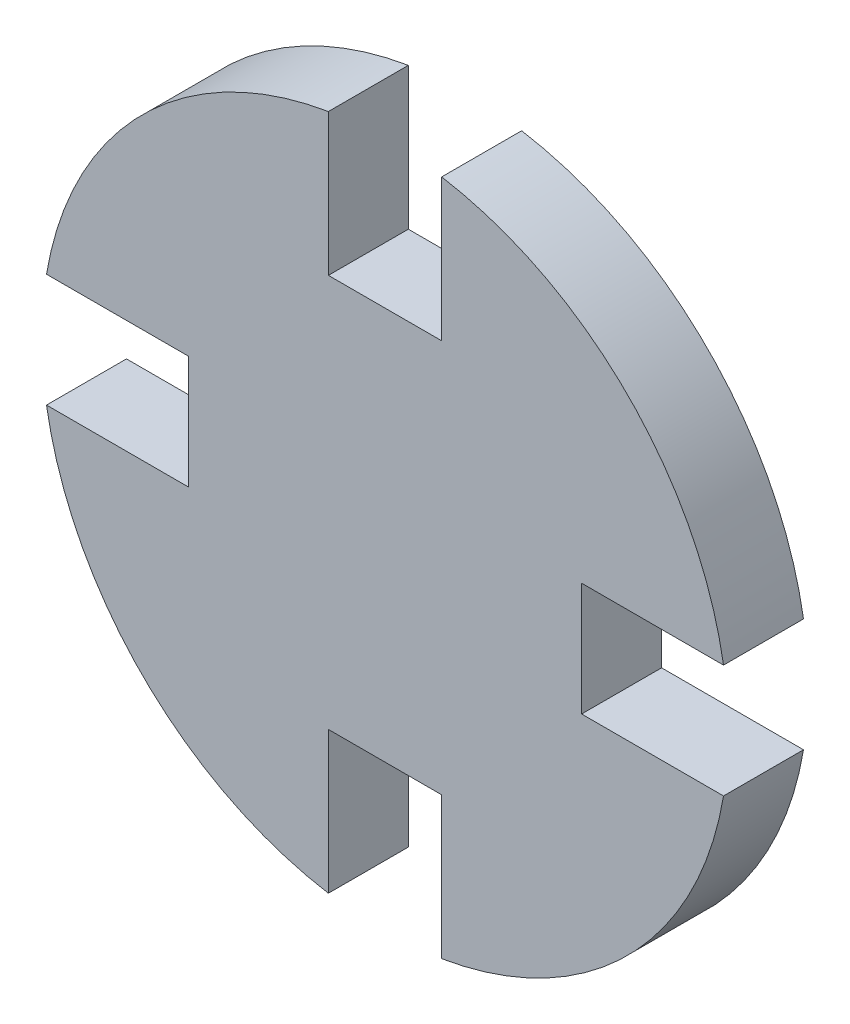
ISO-10303-21;
HEADER;
FILE_DESCRIPTION(('STEP AP214'),'2;1');
FILE_NAME('part.step','',(''),(''),'','','');
FILE_SCHEMA(('AUTOMOTIVE_DESIGN { 1 0 10303 214 1 1 1 1 }'));
ENDSEC;
DATA;
#1=APPLICATION_CONTEXT('core data for automotive mechanical design processes');
#2=APPLICATION_PROTOCOL_DEFINITION('international standard','automotive_design',2000,#1);
#3=PRODUCT_CONTEXT('',#1,'mechanical');
#4=PRODUCT('Part','Part','',(#3));
#5=PRODUCT_RELATED_PRODUCT_CATEGORY('part','',(#4));
#6=PRODUCT_DEFINITION_FORMATION('','',#4);
#7=PRODUCT_DEFINITION_CONTEXT('part definition',#1,'design');
#8=PRODUCT_DEFINITION('design','',#6,#7);
#9=PRODUCT_DEFINITION_SHAPE('','',#8);
#10=(LENGTH_UNIT() NAMED_UNIT(*) SI_UNIT(.MILLI.,.METRE.));
#11=(NAMED_UNIT(*) PLANE_ANGLE_UNIT() SI_UNIT($,.RADIAN.));
#12=(NAMED_UNIT(*) SI_UNIT($,.STERADIAN.) SOLID_ANGLE_UNIT());
#13=UNCERTAINTY_MEASURE_WITH_UNIT(LENGTH_MEASURE(1.E-05),#10,'distance_accuracy_value','');
#14=(GEOMETRIC_REPRESENTATION_CONTEXT(3) GLOBAL_UNCERTAINTY_ASSIGNED_CONTEXT((#13)) GLOBAL_UNIT_ASSIGNED_CONTEXT((#10,
#11,#12)) REPRESENTATION_CONTEXT('',''));
#15=CARTESIAN_POINT('',(0.,0.,0.));
#16=DIRECTION('',(0.,0.,1.));
#17=DIRECTION('',(1.,0.,0.));
#18=AXIS2_PLACEMENT_3D('',#15,#16,#17);
#19=CARTESIAN_POINT('',(0.,0.,3.));
#20=DIRECTION('',(0.,0.,-1.));
#21=DIRECTION('',(-1.,0.,0.));
#22=AXIS2_PLACEMENT_3D('',#19,#20,#21);
#23=CYLINDRICAL_SURFACE('',#22,25.75);
#24=CARTESIAN_POINT('',(0.,0.,-3.));
#25=DIRECTION('',(0.,0.,1.));
#26=DIRECTION('',(1.,0.,0.));
#27=AXIS2_PLACEMENT_3D('',#24,#25,#26);
#28=CIRCLE('',#27,25.75);
#29=CARTESIAN_POINT('',(-4.25,25.3968501984006,-3.));
#30=VERTEX_POINT('',#29);
#31=CARTESIAN_POINT('',(-25.3968501984005,4.25000000000027,-3.));
#32=VERTEX_POINT('',#31);
#33=EDGE_CURVE('E181',#30,#32,#28,.T.);
#34=ORIENTED_EDGE('',*,*,#33,.T.);
#35=DIRECTION('',(0.,0.,-1.));
#36=VECTOR('',#35,1.);
#37=CARTESIAN_POINT('',(-25.3968501984005,4.25000000000027,3.));
#38=LINE('',#37,#36);
#39=CARTESIAN_POINT('',(-25.3968501984005,4.25000000000027,3.));
#40=VERTEX_POINT('',#39);
#41=EDGE_CURVE('E11',#40,#32,#38,.T.);
#42=ORIENTED_EDGE('',*,*,#41,.F.);
#43=CARTESIAN_POINT('',(0.,0.,3.));
#44=DIRECTION('',(0.,0.,1.));
#45=DIRECTION('',(1.,0.,0.));
#46=AXIS2_PLACEMENT_3D('',#43,#44,#45);
#47=CIRCLE('',#46,25.75);
#48=CARTESIAN_POINT('',(-4.25,25.3968501984006,3.));
#49=VERTEX_POINT('',#48);
#50=EDGE_CURVE('E212',#49,#40,#47,.T.);
#51=ORIENTED_EDGE('',*,*,#50,.F.);
#52=DIRECTION('',(0.,0.,-1.));
#53=VECTOR('',#52,1.);
#54=CARTESIAN_POINT('',(-4.25,25.3968501984006,3.));
#55=LINE('',#54,#53);
#56=EDGE_CURVE('E177',#49,#30,#55,.T.);
#57=ORIENTED_EDGE('',*,*,#56,.T.);
#58=EDGE_LOOP('',(#34,#42,#51,#57));
#59=FACE_BOUND('',#58,.T.);
#60=ADVANCED_FACE('F37',(#59),#23,.T.);
#61=CARTESIAN_POINT('',(-25.3968501984005,4.25000000000027,3.));
#62=DIRECTION('',(0.,1.,0.));
#63=DIRECTION('',(-1.,0.,0.));
#64=AXIS2_PLACEMENT_3D('',#61,#62,#63);
#65=PLANE('',#64);
#66=DIRECTION('',(1.,0.,0.));
#67=VECTOR('',#66,1.);
#68=CARTESIAN_POINT('',(-25.3968501984005,4.25000000000027,-3.));
#69=LINE('',#68,#67);
#70=CARTESIAN_POINT('',(-14.75,4.25000000000027,-3.));
#71=VERTEX_POINT('',#70);
#72=EDGE_CURVE('E184',#32,#71,#69,.T.);
#73=ORIENTED_EDGE('',*,*,#72,.T.);
#74=DIRECTION('',(0.,0.,-1.));
#75=VECTOR('',#74,1.);
#76=CARTESIAN_POINT('',(-14.75,4.25000000000027,3.));
#77=LINE('',#76,#75);
#78=CARTESIAN_POINT('',(-14.75,4.25000000000027,3.));
#79=VERTEX_POINT('',#78);
#80=EDGE_CURVE('E45',#79,#71,#77,.T.);
#81=ORIENTED_EDGE('',*,*,#80,.F.);
#82=DIRECTION('',(1.,0.,0.));
#83=VECTOR('',#82,1.);
#84=CARTESIAN_POINT('',(-25.3968501984005,4.25000000000027,3.));
#85=LINE('',#84,#83);
#86=EDGE_CURVE('E120',#40,#79,#85,.T.);
#87=ORIENTED_EDGE('',*,*,#86,.F.);
#88=ORIENTED_EDGE('',*,*,#41,.T.);
#89=EDGE_LOOP('',(#73,#81,#87,#88));
#90=FACE_BOUND('',#89,.T.);
#91=ADVANCED_FACE('F310',(#90),#65,.F.);
#92=CARTESIAN_POINT('',(-14.75,4.25000000000027,3.));
#93=DIRECTION('',(1.,0.,0.));
#94=DIRECTION('',(0.,0.,-1.));
#95=AXIS2_PLACEMENT_3D('',#92,#93,#94);
#96=PLANE('',#95);
#97=DIRECTION('',(0.,-1.,0.));
#98=VECTOR('',#97,1.);
#99=CARTESIAN_POINT('',(-14.75,4.25000000000027,-3.));
#100=LINE('',#99,#98);
#101=CARTESIAN_POINT('',(-14.75,-4.24999999999984,-3.));
#102=VERTEX_POINT('',#101);
#103=EDGE_CURVE('E187',#71,#102,#100,.T.);
#104=ORIENTED_EDGE('',*,*,#103,.T.);
#105=DIRECTION('',(0.,0.,-1.));
#106=VECTOR('',#105,1.);
#107=CARTESIAN_POINT('',(-14.75,-4.24999999999984,3.));
#108=LINE('',#107,#106);
#109=CARTESIAN_POINT('',(-14.75,-4.24999999999984,3.));
#110=VERTEX_POINT('',#109);
#111=EDGE_CURVE('E243',#110,#102,#108,.T.);
#112=ORIENTED_EDGE('',*,*,#111,.F.);
#113=DIRECTION('',(0.,-1.,0.));
#114=VECTOR('',#113,1.);
#115=CARTESIAN_POINT('',(-14.75,4.25000000000027,3.));
#116=LINE('',#115,#114);
#117=EDGE_CURVE('E251',#79,#110,#116,.T.);
#118=ORIENTED_EDGE('',*,*,#117,.F.);
#119=ORIENTED_EDGE('',*,*,#80,.T.);
#120=EDGE_LOOP('',(#104,#112,#118,#119));
#121=FACE_BOUND('',#120,.T.);
#122=ADVANCED_FACE('F249',(#121),#96,.F.);
#123=CARTESIAN_POINT('',(-14.75,-4.24999999999984,3.));
#124=DIRECTION('',(0.,-1.,0.));
#125=DIRECTION('',(1.,0.,0.));
#126=AXIS2_PLACEMENT_3D('',#123,#124,#125);
#127=PLANE('',#126);
#128=DIRECTION('',(-1.,0.,0.));
#129=VECTOR('',#128,1.);
#130=CARTESIAN_POINT('',(-14.75,-4.24999999999984,-3.));
#131=LINE('',#130,#129);
#132=CARTESIAN_POINT('',(-25.3968501984006,-4.24999999999982,-3.));
#133=VERTEX_POINT('',#132);
#134=EDGE_CURVE('E189',#102,#133,#131,.T.);
#135=ORIENTED_EDGE('',*,*,#134,.T.);
#136=DIRECTION('',(0.,0.,-1.));
#137=VECTOR('',#136,1.);
#138=CARTESIAN_POINT('',(-25.3968501984006,-4.24999999999982,3.));
#139=LINE('',#138,#137);
#140=CARTESIAN_POINT('',(-25.3968501984006,-4.24999999999982,3.));
#141=VERTEX_POINT('',#140);
#142=EDGE_CURVE('E240',#141,#133,#139,.T.);
#143=ORIENTED_EDGE('',*,*,#142,.F.);
#144=DIRECTION('',(-1.,0.,0.));
#145=VECTOR('',#144,1.);
#146=CARTESIAN_POINT('',(-14.75,-4.24999999999984,3.));
#147=LINE('',#146,#145);
#148=EDGE_CURVE('E269',#110,#141,#147,.T.);
#149=ORIENTED_EDGE('',*,*,#148,.F.);
#150=ORIENTED_EDGE('',*,*,#111,.T.);
#151=EDGE_LOOP('',(#135,#143,#149,#150));
#152=FACE_BOUND('',#151,.T.);
#153=ADVANCED_FACE('F260',(#152),#127,.F.);
#154=CARTESIAN_POINT('',(0.,0.,3.));
#155=DIRECTION('',(0.,0.,-1.));
#156=DIRECTION('',(-1.,0.,0.));
#157=AXIS2_PLACEMENT_3D('',#154,#155,#156);
#158=CYLINDRICAL_SURFACE('',#157,25.75);
#159=CARTESIAN_POINT('',(0.,0.,-3.));
#160=DIRECTION('',(0.,0.,1.));
#161=DIRECTION('',(1.,0.,0.));
#162=AXIS2_PLACEMENT_3D('',#159,#160,#161);
#163=CIRCLE('',#162,25.75);
#164=CARTESIAN_POINT('',(-4.25,-25.3968501984006,-3.));
#165=VERTEX_POINT('',#164);
#166=EDGE_CURVE('E191',#133,#165,#163,.T.);
#167=ORIENTED_EDGE('',*,*,#166,.T.);
#168=DIRECTION('',(0.,0.,-1.));
#169=VECTOR('',#168,1.);
#170=CARTESIAN_POINT('',(-4.25,-25.3968501984006,3.));
#171=LINE('',#170,#169);
#172=CARTESIAN_POINT('',(-4.25,-25.3968501984006,3.));
#173=VERTEX_POINT('',#172);
#174=EDGE_CURVE('E237',#173,#165,#171,.T.);
#175=ORIENTED_EDGE('',*,*,#174,.F.);
#176=CARTESIAN_POINT('',(0.,0.,3.));
#177=DIRECTION('',(0.,0.,1.));
#178=DIRECTION('',(1.,0.,0.));
#179=AXIS2_PLACEMENT_3D('',#176,#177,#178);
#180=CIRCLE('',#179,25.75);
#181=EDGE_CURVE('E266',#141,#173,#180,.T.);
#182=ORIENTED_EDGE('',*,*,#181,.F.);
#183=ORIENTED_EDGE('',*,*,#142,.T.);
#184=EDGE_LOOP('',(#167,#175,#182,#183));
#185=FACE_BOUND('',#184,.T.);
#186=ADVANCED_FACE('F264',(#185),#158,.T.);
#187=CARTESIAN_POINT('',(-4.25,-25.3968501984006,3.));
#188=DIRECTION('',(-1.,0.,0.));
#189=DIRECTION('',(0.,-1.,0.));
#190=AXIS2_PLACEMENT_3D('',#187,#188,#189);
#191=PLANE('',#190);
#192=DIRECTION('',(0.,1.,0.));
#193=VECTOR('',#192,1.);
#194=CARTESIAN_POINT('',(-4.25,-25.3968501984006,-3.));
#195=LINE('',#194,#193);
#196=CARTESIAN_POINT('',(-4.25,-14.75,-3.));
#197=VERTEX_POINT('',#196);
#198=EDGE_CURVE('E193',#165,#197,#195,.T.);
#199=ORIENTED_EDGE('',*,*,#198,.T.);
#200=DIRECTION('',(0.,0.,-1.));
#201=VECTOR('',#200,1.);
#202=CARTESIAN_POINT('',(-4.25,-14.75,3.));
#203=LINE('',#202,#201);
#204=CARTESIAN_POINT('',(-4.25,-14.75,3.));
#205=VERTEX_POINT('',#204);
#206=EDGE_CURVE('E234',#205,#197,#203,.T.);
#207=ORIENTED_EDGE('',*,*,#206,.F.);
#208=DIRECTION('',(0.,1.,0.));
#209=VECTOR('',#208,1.);
#210=CARTESIAN_POINT('',(-4.25,-25.3968501984006,3.));
#211=LINE('',#210,#209);
#212=EDGE_CURVE('E268',#173,#205,#211,.T.);
#213=ORIENTED_EDGE('',*,*,#212,.F.);
#214=ORIENTED_EDGE('',*,*,#174,.T.);
#215=EDGE_LOOP('',(#199,#207,#213,#214));
#216=FACE_BOUND('',#215,.T.);
#217=ADVANCED_FACE('F323',(#216),#191,.F.);
#218=CARTESIAN_POINT('',(-4.25,-14.75,3.));
#219=DIRECTION('',(0.,1.,0.));
#220=DIRECTION('',(0.,0.,1.));
#221=AXIS2_PLACEMENT_3D('',#218,#219,#220);
#222=PLANE('',#221);
#223=DIRECTION('',(1.,0.,0.));
#224=VECTOR('',#223,1.);
#225=CARTESIAN_POINT('',(-4.25,-14.75,-3.));
#226=LINE('',#225,#224);
#227=CARTESIAN_POINT('',(4.25,-14.75,-3.));
#228=VERTEX_POINT('',#227);
#229=EDGE_CURVE('E195',#197,#228,#226,.T.);
#230=ORIENTED_EDGE('',*,*,#229,.T.);
#231=DIRECTION('',(0.,0.,-1.));
#232=VECTOR('',#231,1.);
#233=CARTESIAN_POINT('',(4.25,-14.75,3.));
#234=LINE('',#233,#232);
#235=CARTESIAN_POINT('',(4.25,-14.75,3.));
#236=VERTEX_POINT('',#235);
#237=EDGE_CURVE('E231',#236,#228,#234,.T.);
#238=ORIENTED_EDGE('',*,*,#237,.F.);
#239=DIRECTION('',(1.,0.,0.));
#240=VECTOR('',#239,1.);
#241=CARTESIAN_POINT('',(-4.25,-14.75,3.));
#242=LINE('',#241,#240);
#243=EDGE_CURVE('E271',#205,#236,#242,.T.);
#244=ORIENTED_EDGE('',*,*,#243,.F.);
#245=ORIENTED_EDGE('',*,*,#206,.T.);
#246=EDGE_LOOP('',(#230,#238,#244,#245));
#247=FACE_BOUND('',#246,.T.);
#248=ADVANCED_FACE('F326',(#247),#222,.F.);
#249=CARTESIAN_POINT('',(4.25,-14.75,3.));
#250=DIRECTION('',(1.,0.,0.));
#251=DIRECTION('',(0.,1.,0.));
#252=AXIS2_PLACEMENT_3D('',#249,#250,#251);
#253=PLANE('',#252);
#254=DIRECTION('',(0.,-1.,0.));
#255=VECTOR('',#254,1.);
#256=CARTESIAN_POINT('',(4.25,-14.75,-3.));
#257=LINE('',#256,#255);
#258=CARTESIAN_POINT('',(4.24999999999999,-25.3968501984006,-3.));
#259=VERTEX_POINT('',#258);
#260=EDGE_CURVE('E197',#228,#259,#257,.T.);
#261=ORIENTED_EDGE('',*,*,#260,.T.);
#262=DIRECTION('',(0.,0.,-1.));
#263=VECTOR('',#262,1.);
#264=CARTESIAN_POINT('',(4.24999999999999,-25.3968501984006,3.));
#265=LINE('',#264,#263);
#266=CARTESIAN_POINT('',(4.24999999999999,-25.3968501984006,3.));
#267=VERTEX_POINT('',#266);
#268=EDGE_CURVE('E228',#267,#259,#265,.T.);
#269=ORIENTED_EDGE('',*,*,#268,.F.);
#270=DIRECTION('',(0.,-1.,0.));
#271=VECTOR('',#270,1.);
#272=CARTESIAN_POINT('',(4.25,-14.75,3.));
#273=LINE('',#272,#271);
#274=EDGE_CURVE('E277',#236,#267,#273,.T.);
#275=ORIENTED_EDGE('',*,*,#274,.F.);
#276=ORIENTED_EDGE('',*,*,#237,.T.);
#277=EDGE_LOOP('',(#261,#269,#275,#276));
#278=FACE_BOUND('',#277,.T.);
#279=ADVANCED_FACE('F330',(#278),#253,.F.);
#280=CARTESIAN_POINT('',(0.,0.,3.));
#281=DIRECTION('',(0.,0.,-1.));
#282=DIRECTION('',(-1.,0.,0.));
#283=AXIS2_PLACEMENT_3D('',#280,#281,#282);
#284=CYLINDRICAL_SURFACE('',#283,25.75);
#285=CARTESIAN_POINT('',(0.,0.,-3.));
#286=DIRECTION('',(0.,0.,1.));
#287=DIRECTION('',(1.,0.,0.));
#288=AXIS2_PLACEMENT_3D('',#285,#286,#287);
#289=CIRCLE('',#288,25.75);
#290=CARTESIAN_POINT('',(25.3968501984006,-4.24999999999984,-3.));
#291=VERTEX_POINT('',#290);
#292=EDGE_CURVE('E199',#259,#291,#289,.T.);
#293=ORIENTED_EDGE('',*,*,#292,.T.);
#294=DIRECTION('',(0.,0.,-1.));
#295=VECTOR('',#294,1.);
#296=CARTESIAN_POINT('',(25.3968501984006,-4.24999999999984,3.));
#297=LINE('',#296,#295);
#298=CARTESIAN_POINT('',(25.3968501984006,-4.24999999999984,3.));
#299=VERTEX_POINT('',#298);
#300=EDGE_CURVE('E225',#299,#291,#297,.T.);
#301=ORIENTED_EDGE('',*,*,#300,.F.);
#302=CARTESIAN_POINT('',(0.,0.,3.));
#303=DIRECTION('',(0.,0.,1.));
#304=DIRECTION('',(1.,0.,0.));
#305=AXIS2_PLACEMENT_3D('',#302,#303,#304);
#306=CIRCLE('',#305,25.75);
#307=EDGE_CURVE('E279',#267,#299,#306,.T.);
#308=ORIENTED_EDGE('',*,*,#307,.F.);
#309=ORIENTED_EDGE('',*,*,#268,.T.);
#310=EDGE_LOOP('',(#293,#301,#308,#309));
#311=FACE_BOUND('',#310,.T.);
#312=ADVANCED_FACE('F334',(#311),#284,.T.);
#313=CARTESIAN_POINT('',(25.3968501984006,-4.24999999999984,3.));
#314=DIRECTION('',(0.,-1.,0.));
#315=DIRECTION('',(1.,0.,0.));
#316=AXIS2_PLACEMENT_3D('',#313,#314,#315);
#317=PLANE('',#316);
#318=DIRECTION('',(-1.,0.,0.));
#319=VECTOR('',#318,1.);
#320=CARTESIAN_POINT('',(25.3968501984006,-4.24999999999984,-3.));
#321=LINE('',#320,#319);
#322=CARTESIAN_POINT('',(14.75,-4.24999999999984,-3.));
#323=VERTEX_POINT('',#322);
#324=EDGE_CURVE('E201',#291,#323,#321,.T.);
#325=ORIENTED_EDGE('',*,*,#324,.T.);
#326=DIRECTION('',(0.,0.,-1.));
#327=VECTOR('',#326,1.);
#328=CARTESIAN_POINT('',(14.75,-4.24999999999984,3.));
#329=LINE('',#328,#327);
#330=CARTESIAN_POINT('',(14.75,-4.24999999999984,3.));
#331=VERTEX_POINT('',#330);
#332=EDGE_CURVE('E222',#331,#323,#329,.T.);
#333=ORIENTED_EDGE('',*,*,#332,.F.);
#334=DIRECTION('',(-1.,0.,0.));
#335=VECTOR('',#334,1.);
#336=CARTESIAN_POINT('',(25.3968501984006,-4.24999999999984,3.));
#337=LINE('',#336,#335);
#338=EDGE_CURVE('E281',#299,#331,#337,.T.);
#339=ORIENTED_EDGE('',*,*,#338,.F.);
#340=ORIENTED_EDGE('',*,*,#300,.T.);
#341=EDGE_LOOP('',(#325,#333,#339,#340));
#342=FACE_BOUND('',#341,.T.);
#343=ADVANCED_FACE('F338',(#342),#317,.F.);
#344=CARTESIAN_POINT('',(14.75,-4.24999999999984,3.));
#345=DIRECTION('',(-1.,0.,0.));
#346=DIRECTION('',(0.,0.,1.));
#347=AXIS2_PLACEMENT_3D('',#344,#345,#346);
#348=PLANE('',#347);
#349=DIRECTION('',(0.,1.,0.));
#350=VECTOR('',#349,1.);
#351=CARTESIAN_POINT('',(14.75,-4.24999999999984,-3.));
#352=LINE('',#351,#350);
#353=CARTESIAN_POINT('',(14.75,4.25000000000028,-3.));
#354=VERTEX_POINT('',#353);
#355=EDGE_CURVE('E203',#323,#354,#352,.T.);
#356=ORIENTED_EDGE('',*,*,#355,.T.);
#357=DIRECTION('',(0.,0.,-1.));
#358=VECTOR('',#357,1.);
#359=CARTESIAN_POINT('',(14.75,4.25000000000028,3.));
#360=LINE('',#359,#358);
#361=CARTESIAN_POINT('',(14.75,4.25000000000028,3.));
#362=VERTEX_POINT('',#361);
#363=EDGE_CURVE('E219',#362,#354,#360,.T.);
#364=ORIENTED_EDGE('',*,*,#363,.F.);
#365=DIRECTION('',(0.,1.,0.));
#366=VECTOR('',#365,1.);
#367=CARTESIAN_POINT('',(14.75,-4.24999999999984,3.));
#368=LINE('',#367,#366);
#369=EDGE_CURVE('E283',#331,#362,#368,.T.);
#370=ORIENTED_EDGE('',*,*,#369,.F.);
#371=ORIENTED_EDGE('',*,*,#332,.T.);
#372=EDGE_LOOP('',(#356,#364,#370,#371));
#373=FACE_BOUND('',#372,.T.);
#374=ADVANCED_FACE('F342',(#373),#348,.F.);
#375=CARTESIAN_POINT('',(14.75,4.25000000000028,3.));
#376=DIRECTION('',(0.,1.,0.));
#377=DIRECTION('',(0.,0.,1.));
#378=AXIS2_PLACEMENT_3D('',#375,#376,#377);
#379=PLANE('',#378);
#380=DIRECTION('',(1.,0.,0.));
#381=VECTOR('',#380,1.);
#382=CARTESIAN_POINT('',(14.75,4.25000000000028,-3.));
#383=LINE('',#382,#381);
#384=CARTESIAN_POINT('',(25.3968501984005,4.25000000000028,-3.));
#385=VERTEX_POINT('',#384);
#386=EDGE_CURVE('E205',#354,#385,#383,.T.);
#387=ORIENTED_EDGE('',*,*,#386,.T.);
#388=DIRECTION('',(0.,0.,-1.));
#389=VECTOR('',#388,1.);
#390=CARTESIAN_POINT('',(25.3968501984005,4.25000000000028,3.));
#391=LINE('',#390,#389);
#392=CARTESIAN_POINT('',(25.3968501984005,4.25000000000028,3.));
#393=VERTEX_POINT('',#392);
#394=EDGE_CURVE('E216',#393,#385,#391,.T.);
#395=ORIENTED_EDGE('',*,*,#394,.F.);
#396=DIRECTION('',(1.,0.,0.));
#397=VECTOR('',#396,1.);
#398=CARTESIAN_POINT('',(14.75,4.25000000000028,3.));
#399=LINE('',#398,#397);
#400=EDGE_CURVE('E285',#362,#393,#399,.T.);
#401=ORIENTED_EDGE('',*,*,#400,.F.);
#402=ORIENTED_EDGE('',*,*,#363,.T.);
#403=EDGE_LOOP('',(#387,#395,#401,#402));
#404=FACE_BOUND('',#403,.T.);
#405=ADVANCED_FACE('F291',(#404),#379,.F.);
#406=CARTESIAN_POINT('',(0.,0.,3.));
#407=DIRECTION('',(0.,0.,-1.));
#408=DIRECTION('',(-1.,0.,0.));
#409=AXIS2_PLACEMENT_3D('',#406,#407,#408);
#410=CYLINDRICAL_SURFACE('',#409,25.75);
#411=CARTESIAN_POINT('',(0.,0.,-3.));
#412=DIRECTION('',(0.,0.,1.));
#413=DIRECTION('',(1.,0.,0.));
#414=AXIS2_PLACEMENT_3D('',#411,#412,#413);
#415=CIRCLE('',#414,25.75);
#416=CARTESIAN_POINT('',(4.24999999999999,25.3968501984006,-3.));
#417=VERTEX_POINT('',#416);
#418=EDGE_CURVE('E207',#385,#417,#415,.T.);
#419=ORIENTED_EDGE('',*,*,#418,.T.);
#420=DIRECTION('',(0.,0.,-1.));
#421=VECTOR('',#420,1.);
#422=CARTESIAN_POINT('',(4.24999999999999,25.3968501984006,3.));
#423=LINE('',#422,#421);
#424=CARTESIAN_POINT('',(4.24999999999999,25.3968501984006,3.));
#425=VERTEX_POINT('',#424);
#426=EDGE_CURVE('E172',#425,#417,#423,.T.);
#427=ORIENTED_EDGE('',*,*,#426,.F.);
#428=CARTESIAN_POINT('',(0.,0.,3.));
#429=DIRECTION('',(0.,0.,1.));
#430=DIRECTION('',(1.,0.,0.));
#431=AXIS2_PLACEMENT_3D('',#428,#429,#430);
#432=CIRCLE('',#431,25.75);
#433=EDGE_CURVE('E163',#393,#425,#432,.T.);
#434=ORIENTED_EDGE('',*,*,#433,.F.);
#435=ORIENTED_EDGE('',*,*,#394,.T.);
#436=EDGE_LOOP('',(#419,#427,#434,#435));
#437=FACE_BOUND('',#436,.T.);
#438=ADVANCED_FACE('F295',(#437),#410,.T.);
#439=CARTESIAN_POINT('',(4.24999999999999,25.3968501984006,3.));
#440=DIRECTION('',(1.,0.,0.));
#441=DIRECTION('',(0.,1.,0.));
#442=AXIS2_PLACEMENT_3D('',#439,#440,#441);
#443=PLANE('',#442);
#444=DIRECTION('',(0.,-1.,0.));
#445=VECTOR('',#444,1.);
#446=CARTESIAN_POINT('',(4.24999999999999,25.3968501984006,-3.));
#447=LINE('',#446,#445);
#448=CARTESIAN_POINT('',(4.24999999999999,14.75,-3.));
#449=VERTEX_POINT('',#448);
#450=EDGE_CURVE('E171',#417,#449,#447,.T.);
#451=ORIENTED_EDGE('',*,*,#450,.T.);
#452=DIRECTION('',(0.,0.,-1.));
#453=VECTOR('',#452,1.);
#454=CARTESIAN_POINT('',(4.24999999999999,14.75,3.));
#455=LINE('',#454,#453);
#456=CARTESIAN_POINT('',(4.24999999999999,14.75,3.));
#457=VERTEX_POINT('',#456);
#458=EDGE_CURVE('E168',#457,#449,#455,.T.);
#459=ORIENTED_EDGE('',*,*,#458,.F.);
#460=DIRECTION('',(0.,-1.,0.));
#461=VECTOR('',#460,1.);
#462=CARTESIAN_POINT('',(4.24999999999999,25.3968501984006,3.));
#463=LINE('',#462,#461);
#464=EDGE_CURVE('E157',#425,#457,#463,.T.);
#465=ORIENTED_EDGE('',*,*,#464,.F.);
#466=ORIENTED_EDGE('',*,*,#426,.T.);
#467=EDGE_LOOP('',(#451,#459,#465,#466));
#468=FACE_BOUND('',#467,.T.);
#469=ADVANCED_FACE('F169',(#468),#443,.F.);
#470=CARTESIAN_POINT('',(4.24999999999999,14.75,3.));
#471=DIRECTION('',(0.,-1.,0.));
#472=DIRECTION('',(0.,0.,-1.));
#473=AXIS2_PLACEMENT_3D('',#470,#471,#472);
#474=PLANE('',#473);
#475=DIRECTION('',(-1.,0.,0.));
#476=VECTOR('',#475,1.);
#477=CARTESIAN_POINT('',(4.24999999999999,14.75,-3.));
#478=LINE('',#477,#476);
#479=CARTESIAN_POINT('',(-4.25,14.75,-3.));
#480=VERTEX_POINT('',#479);
#481=EDGE_CURVE('E106',#449,#480,#478,.T.);
#482=ORIENTED_EDGE('',*,*,#481,.T.);
#483=DIRECTION('',(0.,0.,-1.));
#484=VECTOR('',#483,1.);
#485=CARTESIAN_POINT('',(-4.25,14.75,3.));
#486=LINE('',#485,#484);
#487=CARTESIAN_POINT('',(-4.25,14.75,3.));
#488=VERTEX_POINT('',#487);
#489=EDGE_CURVE('E173',#488,#480,#486,.T.);
#490=ORIENTED_EDGE('',*,*,#489,.F.);
#491=DIRECTION('',(-1.,0.,0.));
#492=VECTOR('',#491,1.);
#493=CARTESIAN_POINT('',(4.24999999999999,14.75,3.));
#494=LINE('',#493,#492);
#495=EDGE_CURVE('E161',#457,#488,#494,.T.);
#496=ORIENTED_EDGE('',*,*,#495,.F.);
#497=ORIENTED_EDGE('',*,*,#458,.T.);
#498=EDGE_LOOP('',(#482,#490,#496,#497));
#499=FACE_BOUND('',#498,.T.);
#500=ADVANCED_FACE('F175',(#499),#474,.F.);
#501=CARTESIAN_POINT('',(-4.25,14.75,3.));
#502=DIRECTION('',(-1.,0.,0.));
#503=DIRECTION('',(0.,-1.,0.));
#504=AXIS2_PLACEMENT_3D('',#501,#502,#503);
#505=PLANE('',#504);
#506=DIRECTION('',(0.,1.,0.));
#507=VECTOR('',#506,1.);
#508=CARTESIAN_POINT('',(-4.25,14.75,-3.));
#509=LINE('',#508,#507);
#510=EDGE_CURVE('E112',#480,#30,#509,.T.);
#511=ORIENTED_EDGE('',*,*,#510,.T.);
#512=ORIENTED_EDGE('',*,*,#56,.F.);
#513=DIRECTION('',(0.,1.,0.));
#514=VECTOR('',#513,1.);
#515=CARTESIAN_POINT('',(-4.25,14.75,3.));
#516=LINE('',#515,#514);
#517=EDGE_CURVE('E53',#488,#49,#516,.T.);
#518=ORIENTED_EDGE('',*,*,#517,.F.);
#519=ORIENTED_EDGE('',*,*,#489,.T.);
#520=EDGE_LOOP('',(#511,#512,#518,#519));
#521=FACE_BOUND('',#520,.T.);
#522=ADVANCED_FACE('F299',(#521),#505,.F.);
#523=CARTESIAN_POINT('',(0.,0.,3.));
#524=DIRECTION('',(0.,0.,1.));
#525=DIRECTION('',(1.,0.,0.));
#526=AXIS2_PLACEMENT_3D('',#523,#524,#525);
#527=PLANE('',#526);
#528=ORIENTED_EDGE('',*,*,#50,.T.);
#529=ORIENTED_EDGE('',*,*,#86,.T.);
#530=ORIENTED_EDGE('',*,*,#117,.T.);
#531=ORIENTED_EDGE('',*,*,#148,.T.);
#532=ORIENTED_EDGE('',*,*,#181,.T.);
#533=ORIENTED_EDGE('',*,*,#212,.T.);
#534=ORIENTED_EDGE('',*,*,#243,.T.);
#535=ORIENTED_EDGE('',*,*,#274,.T.);
#536=ORIENTED_EDGE('',*,*,#307,.T.);
#537=ORIENTED_EDGE('',*,*,#338,.T.);
#538=ORIENTED_EDGE('',*,*,#369,.T.);
#539=ORIENTED_EDGE('',*,*,#400,.T.);
#540=ORIENTED_EDGE('',*,*,#433,.T.);
#541=ORIENTED_EDGE('',*,*,#464,.T.);
#542=ORIENTED_EDGE('',*,*,#495,.T.);
#543=ORIENTED_EDGE('',*,*,#517,.T.);
#544=EDGE_LOOP('',(#528,#529,#530,#531,#532,#533,#534,#535,#536,#537,#538,#539,#540,#541,#542,#543));
#545=FACE_BOUND('',#544,.T.);
#546=ADVANCED_FACE('F159',(#545),#527,.T.);
#547=CARTESIAN_POINT('',(0.,0.,-3.));
#548=DIRECTION('',(0.,0.,1.));
#549=DIRECTION('',(1.,0.,0.));
#550=AXIS2_PLACEMENT_3D('',#547,#548,#549);
#551=PLANE('',#550);
#552=CARTESIAN_POINT('',(0.,0.,-3.));
#553=DIRECTION('',(0.,0.,-1.));
#554=DIRECTION('',(-1.,0.,0.));
#555=AXIS2_PLACEMENT_3D('',#552,#553,#554);
#556=CIRCLE('',#555,5.1);
#557=CARTESIAN_POINT('',(-5.1,0.,-3.));
#558=VERTEX_POINT('',#557);
#559=EDGE_CURVE('E518',#558,#558,#556,.T.);
#560=ORIENTED_EDGE('',*,*,#559,.F.);
#561=EDGE_LOOP('',(#560));
#562=FACE_BOUND('',#561,.T.);
#563=ORIENTED_EDGE('',*,*,#33,.F.);
#564=ORIENTED_EDGE('',*,*,#510,.F.);
#565=ORIENTED_EDGE('',*,*,#481,.F.);
#566=ORIENTED_EDGE('',*,*,#450,.F.);
#567=ORIENTED_EDGE('',*,*,#418,.F.);
#568=ORIENTED_EDGE('',*,*,#386,.F.);
#569=ORIENTED_EDGE('',*,*,#355,.F.);
#570=ORIENTED_EDGE('',*,*,#324,.F.);
#571=ORIENTED_EDGE('',*,*,#292,.F.);
#572=ORIENTED_EDGE('',*,*,#260,.F.);
#573=ORIENTED_EDGE('',*,*,#229,.F.);
#574=ORIENTED_EDGE('',*,*,#198,.F.);
#575=ORIENTED_EDGE('',*,*,#166,.F.);
#576=ORIENTED_EDGE('',*,*,#134,.F.);
#577=ORIENTED_EDGE('',*,*,#103,.F.);
#578=ORIENTED_EDGE('',*,*,#72,.F.);
#579=EDGE_LOOP('',(#563,#564,#565,#566,#567,#568,#569,#570,#571,#572,#573,#574,#575,#576,#577,#578));
#580=FACE_BOUND('',#579,.T.);
#581=ADVANCED_FACE('F255',(#562,#580),#551,.F.);
#582=CARTESIAN_POINT('',(0.,0.,-0.5));
#583=DIRECTION('',(0.,0.,-1.));
#584=DIRECTION('',(-1.,0.,0.));
#585=AXIS2_PLACEMENT_3D('',#582,#583,#584);
#586=CYLINDRICAL_SURFACE('',#585,5.1);
#587=CARTESIAN_POINT('',(0.,0.,-0.5));
#588=DIRECTION('',(0.,0.,-1.));
#589=DIRECTION('',(-1.,0.,0.));
#590=AXIS2_PLACEMENT_3D('',#587,#588,#589);
#591=CIRCLE('',#590,5.1);
#592=CARTESIAN_POINT('',(-5.1,0.,-0.5));
#593=VERTEX_POINT('',#592);
#594=EDGE_CURVE('E185',#593,#593,#591,.T.);
#595=ORIENTED_EDGE('',*,*,#594,.F.);
#596=EDGE_LOOP('',(#595));
#597=FACE_BOUND('',#596,.T.);
#598=ORIENTED_EDGE('',*,*,#559,.T.);
#599=EDGE_LOOP('',(#598));
#600=FACE_BOUND('',#599,.T.);
#601=ADVANCED_FACE('F382',(#597,#600),#586,.F.);
#602=CARTESIAN_POINT('',(0.,0.,-0.5));
#603=DIRECTION('',(0.,0.,-1.));
#604=DIRECTION('',(-1.,0.,0.));
#605=AXIS2_PLACEMENT_3D('',#602,#603,#604);
#606=PLANE('',#605);
#607=ORIENTED_EDGE('',*,*,#594,.T.);
#608=EDGE_LOOP('',(#607));
#609=FACE_BOUND('',#608,.T.);
#610=ADVANCED_FACE('F392',(#609),#606,.T.);
#611=CLOSED_SHELL('',(#60,#91,#122,#153,#186,#217,#248,#279,#312,#343,#374,#405,#438,#469,#500,
#522,#546,#581,#601,#610));
#612=MANIFOLD_SOLID_BREP('B2',#611);
#613=ADVANCED_BREP_SHAPE_REPRESENTATION('',(#18,#612),#14);
#614=SHAPE_DEFINITION_REPRESENTATION(#9,#613);
ENDSEC;
END-ISO-10303-21;
